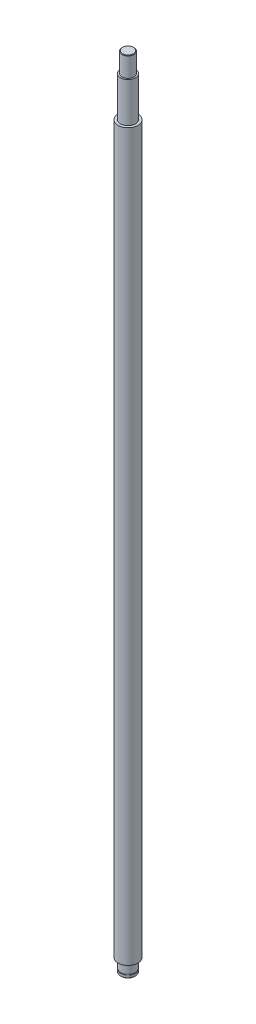
ISO-10303-21;
HEADER;
FILE_DESCRIPTION(('STEP AP214'),'2;1');
FILE_NAME('part.step','',(''),(''),'','','');
FILE_SCHEMA(('AUTOMOTIVE_DESIGN { 1 0 10303 214 1 1 1 1 }'));
ENDSEC;
DATA;
#1=APPLICATION_CONTEXT('core data for automotive mechanical design processes');
#2=APPLICATION_PROTOCOL_DEFINITION('international standard','automotive_design',2000,#1);
#3=PRODUCT_CONTEXT('',#1,'mechanical');
#4=PRODUCT('Part','Part','',(#3));
#5=PRODUCT_RELATED_PRODUCT_CATEGORY('part','',(#4));
#6=PRODUCT_DEFINITION_FORMATION('','',#4);
#7=PRODUCT_DEFINITION_CONTEXT('part definition',#1,'design');
#8=PRODUCT_DEFINITION('design','',#6,#7);
#9=PRODUCT_DEFINITION_SHAPE('','',#8);
#10=(LENGTH_UNIT() NAMED_UNIT(*) SI_UNIT(.MILLI.,.METRE.));
#11=(NAMED_UNIT(*) PLANE_ANGLE_UNIT() SI_UNIT($,.RADIAN.));
#12=(NAMED_UNIT(*) SI_UNIT($,.STERADIAN.) SOLID_ANGLE_UNIT());
#13=UNCERTAINTY_MEASURE_WITH_UNIT(LENGTH_MEASURE(1.E-05),#10,'distance_accuracy_value','');
#14=(GEOMETRIC_REPRESENTATION_CONTEXT(3) GLOBAL_UNCERTAINTY_ASSIGNED_CONTEXT((#13)) GLOBAL_UNIT_ASSIGNED_CONTEXT((#10,
#11,#12)) REPRESENTATION_CONTEXT('',''));
#15=CARTESIAN_POINT('',(0.,0.,0.));
#16=DIRECTION('',(0.,0.,1.));
#17=DIRECTION('',(1.,0.,0.));
#18=AXIS2_PLACEMENT_3D('',#15,#16,#17);
#19=CARTESIAN_POINT('',(0.,-800.,7.49999999999984));
#20=DIRECTION('',(0.,-1.,0.));
#21=DIRECTION('',(0.,0.,-1.));
#22=AXIS2_PLACEMENT_3D('',#19,#20,#21);
#23=PLANE('',#22);
#24=CARTESIAN_POINT('',(0.,-800.,-2.45029690981724E-13));
#25=DIRECTION('',(0.,1.,0.));
#26=DIRECTION('',(0.,0.,1.));
#27=AXIS2_PLACEMENT_3D('',#24,#25,#26);
#28=CIRCLE('',#27,7.0000000000001);
#29=CARTESIAN_POINT('',(0.,-800.,6.99999999999986));
#30=VERTEX_POINT('',#29);
#31=EDGE_CURVE('E16',#30,#30,#28,.T.);
#32=ORIENTED_EDGE('',*,*,#31,.F.);
#33=EDGE_LOOP('',(#32));
#34=FACE_BOUND('',#33,.T.);
#35=ADVANCED_FACE('F13',(#34),#23,.T.);
#36=CARTESIAN_POINT('',(0.,-799.5,-2.45029690981724E-13));
#37=DIRECTION('',(0.,1.,0.));
#38=DIRECTION('',(0.,0.,1.));
#39=AXIS2_PLACEMENT_3D('',#36,#37,#38);
#40=CONICAL_SURFACE('',#39,7.50000000000009,0.785398163397493);
#41=ORIENTED_EDGE('',*,*,#31,.T.);
#42=EDGE_LOOP('',(#41));
#43=FACE_BOUND('',#42,.T.);
#44=CARTESIAN_POINT('',(0.,-799.5,-2.45205938886883E-13));
#45=DIRECTION('',(0.,1.,0.));
#46=DIRECTION('',(0.,0.,1.));
#47=AXIS2_PLACEMENT_3D('',#44,#45,#46);
#48=CIRCLE('',#47,7.50000000000009);
#49=CARTESIAN_POINT('',(0.,-799.5,7.49999999999984));
#50=VERTEX_POINT('',#49);
#51=EDGE_CURVE('E56',#50,#50,#48,.T.);
#52=ORIENTED_EDGE('',*,*,#51,.F.);
#53=EDGE_LOOP('',(#52));
#54=FACE_BOUND('',#53,.T.);
#55=ADVANCED_FACE('F206',(#43,#54),#40,.T.);
#56=CARTESIAN_POINT('',(0.,0.,0.));
#57=DIRECTION('',(0.,1.,0.));
#58=DIRECTION('',(0.,0.,1.));
#59=AXIS2_PLACEMENT_3D('',#56,#57,#58);
#60=PLANE('',#59);
#61=CARTESIAN_POINT('',(0.,-1.705319913059E-10,0.));
#62=DIRECTION('',(0.,-1.,0.));
#63=DIRECTION('',(0.,0.,-1.));
#64=AXIS2_PLACEMENT_3D('',#61,#62,#63);
#65=CIRCLE('',#64,5.50000000009732);
#66=CARTESIAN_POINT('',(0.,-1.70530301757515E-10,-5.50000000009732));
#67=VERTEX_POINT('',#66);
#68=EDGE_CURVE('E54',#67,#67,#65,.T.);
#69=ORIENTED_EDGE('',*,*,#68,.F.);
#70=EDGE_LOOP('',(#69));
#71=FACE_BOUND('',#70,.T.);
#72=ADVANCED_FACE('F83',(#71),#60,.T.);
#73=CARTESIAN_POINT('',(0.,-798.575,-2.44922242209622E-13));
#74=DIRECTION('',(0.,1.,0.));
#75=DIRECTION('',(0.,0.,1.));
#76=AXIS2_PLACEMENT_3D('',#73,#74,#75);
#77=CYLINDRICAL_SURFACE('',#76,7.50000000000009);
#78=ORIENTED_EDGE('',*,*,#51,.T.);
#79=EDGE_LOOP('',(#78));
#80=FACE_BOUND('',#79,.T.);
#81=CARTESIAN_POINT('',(0.,-797.15,-2.44485195977084E-13));
#82=DIRECTION('',(0.,1.,0.));
#83=DIRECTION('',(0.,0.,1.));
#84=AXIS2_PLACEMENT_3D('',#81,#82,#83);
#85=CIRCLE('',#84,7.50000000000009);
#86=CARTESIAN_POINT('',(0.,-797.15,7.49999999999985));
#87=VERTEX_POINT('',#86);
#88=EDGE_CURVE('E52',#87,#87,#85,.T.);
#89=ORIENTED_EDGE('',*,*,#88,.F.);
#90=EDGE_LOOP('',(#89));
#91=FACE_BOUND('',#90,.T.);
#92=ADVANCED_FACE('F74',(#80,#91),#77,.T.);
#93=CARTESIAN_POINT('',(0.,-0.500000000045022,0.));
#94=DIRECTION('',(0.,-1.,0.));
#95=DIRECTION('',(0.,0.,-1.));
#96=AXIS2_PLACEMENT_3D('',#93,#94,#95);
#97=CONICAL_SURFACE('',#96,6.00000000002865,0.785398163454292);
#98=CARTESIAN_POINT('',(0.,-0.499999999999997,0.));
#99=DIRECTION('',(0.,1.,0.));
#100=DIRECTION('',(0.,0.,1.));
#101=AXIS2_PLACEMENT_3D('',#98,#99,#100);
#102=CIRCLE('',#101,6.);
#103=CARTESIAN_POINT('',(0.,-0.499999999999999,6.));
#104=VERTEX_POINT('',#103);
#105=EDGE_CURVE('E51',#104,#104,#102,.F.);
#106=ORIENTED_EDGE('',*,*,#105,.F.);
#107=EDGE_LOOP('',(#106));
#108=FACE_BOUND('',#107,.T.);
#109=ORIENTED_EDGE('',*,*,#68,.T.);
#110=EDGE_LOOP('',(#109));
#111=FACE_BOUND('',#110,.T.);
#112=ADVANCED_FACE('F71',(#108,#111),#97,.T.);
#113=CARTESIAN_POINT('',(0.,-797.15,7.14999999999967));
#114=DIRECTION('',(0.,1.,0.));
#115=DIRECTION('',(0.,0.,1.));
#116=AXIS2_PLACEMENT_3D('',#113,#114,#115);
#117=PLANE('',#116);
#118=CARTESIAN_POINT('',(0.,-797.15,-2.44485195977085E-13));
#119=DIRECTION('',(0.,1.,0.));
#120=DIRECTION('',(0.,0.,1.));
#121=AXIS2_PLACEMENT_3D('',#118,#119,#120);
#122=CIRCLE('',#121,7.14999999999992);
#123=CARTESIAN_POINT('',(0.,-797.15,7.14999999999968));
#124=VERTEX_POINT('',#123);
#125=EDGE_CURVE('E48',#124,#124,#122,.T.);
#126=ORIENTED_EDGE('',*,*,#125,.F.);
#127=EDGE_LOOP('',(#126));
#128=FACE_BOUND('',#127,.T.);
#129=ORIENTED_EDGE('',*,*,#88,.T.);
#130=EDGE_LOOP('',(#129));
#131=FACE_BOUND('',#130,.T.);
#132=ADVANCED_FACE('F73',(#128,#131),#117,.T.);
#133=CARTESIAN_POINT('',(0.,-10.,0.));
#134=DIRECTION('',(0.,1.,0.));
#135=DIRECTION('',(0.,0.,1.));
#136=AXIS2_PLACEMENT_3D('',#133,#134,#135);
#137=CYLINDRICAL_SURFACE('',#136,6.);
#138=CARTESIAN_POINT('',(0.,-20.,0.));
#139=DIRECTION('',(0.,1.,0.));
#140=DIRECTION('',(0.,0.,1.));
#141=AXIS2_PLACEMENT_3D('',#138,#139,#140);
#142=CIRCLE('',#141,6.);
#143=CARTESIAN_POINT('',(0.,-20.,5.99999999999999));
#144=VERTEX_POINT('',#143);
#145=EDGE_CURVE('E45',#144,#144,#142,.F.);
#146=ORIENTED_EDGE('',*,*,#145,.F.);
#147=EDGE_LOOP('',(#146));
#148=FACE_BOUND('',#147,.T.);
#149=ORIENTED_EDGE('',*,*,#105,.T.);
#150=EDGE_LOOP('',(#149));
#151=FACE_BOUND('',#150,.T.);
#152=ADVANCED_FACE('F69',(#148,#151),#137,.T.);
#153=CARTESIAN_POINT('',(0.,-796.575,-2.44308843988517E-13));
#154=DIRECTION('',(0.,1.,0.));
#155=DIRECTION('',(0.,0.,1.));
#156=AXIS2_PLACEMENT_3D('',#153,#154,#155);
#157=CYLINDRICAL_SURFACE('',#156,7.14999999999992);
#158=ORIENTED_EDGE('',*,*,#125,.T.);
#159=EDGE_LOOP('',(#158));
#160=FACE_BOUND('',#159,.T.);
#161=CARTESIAN_POINT('',(0.,-796.,-2.44132491999949E-13));
#162=DIRECTION('',(0.,1.,0.));
#163=DIRECTION('',(0.,0.,1.));
#164=AXIS2_PLACEMENT_3D('',#161,#162,#163);
#165=CIRCLE('',#164,7.14999999999992);
#166=CARTESIAN_POINT('',(0.,-796.,7.14999999999968));
#167=VERTEX_POINT('',#166);
#168=EDGE_CURVE('E42',#167,#167,#165,.T.);
#169=ORIENTED_EDGE('',*,*,#168,.F.);
#170=EDGE_LOOP('',(#169));
#171=FACE_BOUND('',#170,.T.);
#172=ADVANCED_FACE('F115',(#160,#171),#157,.T.);
#173=CARTESIAN_POINT('',(0.,-20.,6.));
#174=DIRECTION('',(0.,1.,0.));
#175=DIRECTION('',(0.,0.,1.));
#176=AXIS2_PLACEMENT_3D('',#173,#174,#175);
#177=PLANE('',#176);
#178=ORIENTED_EDGE('',*,*,#145,.T.);
#179=EDGE_LOOP('',(#178));
#180=FACE_BOUND('',#179,.T.);
#181=CARTESIAN_POINT('',(0.,-20.,0.));
#182=DIRECTION('',(0.,1.,0.));
#183=DIRECTION('',(0.,0.,1.));
#184=AXIS2_PLACEMENT_3D('',#181,#182,#183);
#185=CIRCLE('',#184,7.5);
#186=CARTESIAN_POINT('',(0.,-20.,7.49999999999999));
#187=VERTEX_POINT('',#186);
#188=EDGE_CURVE('E39',#187,#187,#185,.F.);
#189=ORIENTED_EDGE('',*,*,#188,.F.);
#190=EDGE_LOOP('',(#189));
#191=FACE_BOUND('',#190,.T.);
#192=ADVANCED_FACE('F111',(#180,#191),#177,.T.);
#193=CARTESIAN_POINT('',(0.,-796.,7.49999999999967));
#194=DIRECTION('',(0.,-1.,0.));
#195=DIRECTION('',(0.,0.,-1.));
#196=AXIS2_PLACEMENT_3D('',#193,#194,#195);
#197=PLANE('',#196);
#198=ORIENTED_EDGE('',*,*,#168,.T.);
#199=EDGE_LOOP('',(#198));
#200=FACE_BOUND('',#199,.T.);
#201=CARTESIAN_POINT('',(0.,-796.,-2.44132491999949E-13));
#202=DIRECTION('',(0.,1.,0.));
#203=DIRECTION('',(0.,0.,1.));
#204=AXIS2_PLACEMENT_3D('',#201,#202,#203);
#205=CIRCLE('',#204,7.49999999999992);
#206=CARTESIAN_POINT('',(0.,-796.,7.49999999999968));
#207=VERTEX_POINT('',#206);
#208=EDGE_CURVE('E36',#207,#207,#205,.T.);
#209=ORIENTED_EDGE('',*,*,#208,.F.);
#210=EDGE_LOOP('',(#209));
#211=FACE_BOUND('',#210,.T.);
#212=ADVANCED_FACE('F107',(#200,#211),#197,.T.);
#213=CARTESIAN_POINT('',(0.,-40.,0.));
#214=DIRECTION('',(0.,1.,0.));
#215=DIRECTION('',(0.,0.,1.));
#216=AXIS2_PLACEMENT_3D('',#213,#214,#215);
#217=CYLINDRICAL_SURFACE('',#216,7.5);
#218=CARTESIAN_POINT('',(0.,-60.,0.));
#219=DIRECTION('',(0.,1.,0.));
#220=DIRECTION('',(0.,0.,1.));
#221=AXIS2_PLACEMENT_3D('',#218,#219,#220);
#222=CIRCLE('',#221,7.5);
#223=CARTESIAN_POINT('',(0.,-60.,7.49999999999998));
#224=VERTEX_POINT('',#223);
#225=EDGE_CURVE('E33',#224,#224,#222,.F.);
#226=ORIENTED_EDGE('',*,*,#225,.F.);
#227=EDGE_LOOP('',(#226));
#228=FACE_BOUND('',#227,.T.);
#229=ORIENTED_EDGE('',*,*,#188,.T.);
#230=EDGE_LOOP('',(#229));
#231=FACE_BOUND('',#230,.T.);
#232=ADVANCED_FACE('F103',(#228,#231),#217,.T.);
#233=CARTESIAN_POINT('',(0.,-791.5,-2.42752346002462E-13));
#234=DIRECTION('',(0.,1.,0.));
#235=DIRECTION('',(0.,0.,1.));
#236=AXIS2_PLACEMENT_3D('',#233,#234,#235);
#237=CYLINDRICAL_SURFACE('',#236,7.49999999999992);
#238=ORIENTED_EDGE('',*,*,#208,.T.);
#239=EDGE_LOOP('',(#238));
#240=FACE_BOUND('',#239,.T.);
#241=CARTESIAN_POINT('',(0.,-787.,-2.41372200004975E-13));
#242=DIRECTION('',(0.,1.,0.));
#243=DIRECTION('',(0.,0.,1.));
#244=AXIS2_PLACEMENT_3D('',#241,#242,#243);
#245=CIRCLE('',#244,7.49999999999992);
#246=CARTESIAN_POINT('',(0.,-787.,7.49999999999968));
#247=VERTEX_POINT('',#246);
#248=EDGE_CURVE('E25',#247,#247,#245,.T.);
#249=ORIENTED_EDGE('',*,*,#248,.F.);
#250=EDGE_LOOP('',(#249));
#251=FACE_BOUND('',#250,.T.);
#252=ADVANCED_FACE('F99',(#240,#251),#237,.T.);
#253=CARTESIAN_POINT('',(0.,-60.,7.49999999999999));
#254=DIRECTION('',(0.,1.,0.));
#255=DIRECTION('',(0.,0.,1.));
#256=AXIS2_PLACEMENT_3D('',#253,#254,#255);
#257=PLANE('',#256);
#258=ORIENTED_EDGE('',*,*,#225,.T.);
#259=EDGE_LOOP('',(#258));
#260=FACE_BOUND('',#259,.T.);
#261=CARTESIAN_POINT('',(0.,-60.,0.));
#262=DIRECTION('',(0.,1.,0.));
#263=DIRECTION('',(0.,0.,1.));
#264=AXIS2_PLACEMENT_3D('',#261,#262,#263);
#265=CIRCLE('',#264,10.);
#266=CARTESIAN_POINT('',(0.,-60.,9.99999999999998));
#267=VERTEX_POINT('',#266);
#268=EDGE_CURVE('E20',#267,#267,#265,.F.);
#269=ORIENTED_EDGE('',*,*,#268,.F.);
#270=EDGE_LOOP('',(#269));
#271=FACE_BOUND('',#270,.T.);
#272=ADVANCED_FACE('F92',(#260,#271),#257,.T.);
#273=CARTESIAN_POINT('',(0.,-787.,9.99999999999985));
#274=DIRECTION('',(0.,-1.,0.));
#275=DIRECTION('',(0.,0.,-1.));
#276=AXIS2_PLACEMENT_3D('',#273,#274,#275);
#277=PLANE('',#276);
#278=ORIENTED_EDGE('',*,*,#248,.T.);
#279=EDGE_LOOP('',(#278));
#280=FACE_BOUND('',#279,.T.);
#281=CARTESIAN_POINT('',(0.,-787.,-2.41372200004974E-13));
#282=DIRECTION('',(0.,1.,0.));
#283=DIRECTION('',(0.,0.,1.));
#284=AXIS2_PLACEMENT_3D('',#281,#282,#283);
#285=CIRCLE('',#284,10.);
#286=CARTESIAN_POINT('',(0.,-787.,9.99999999999976));
#287=VERTEX_POINT('',#286);
#288=EDGE_CURVE('E9',#287,#287,#285,.T.);
#289=ORIENTED_EDGE('',*,*,#288,.F.);
#290=EDGE_LOOP('',(#289));
#291=FACE_BOUND('',#290,.T.);
#292=ADVANCED_FACE('F87',(#280,#291),#277,.T.);
#293=CARTESIAN_POINT('',(0.,-423.5,-1.29887073319068E-13));
#294=DIRECTION('',(0.,1.,0.));
#295=DIRECTION('',(0.,0.,1.));
#296=AXIS2_PLACEMENT_3D('',#293,#294,#295);
#297=CYLINDRICAL_SURFACE('',#296,10.);
#298=ORIENTED_EDGE('',*,*,#288,.T.);
#299=EDGE_LOOP('',(#298));
#300=FACE_BOUND('',#299,.T.);
#301=ORIENTED_EDGE('',*,*,#268,.T.);
#302=EDGE_LOOP('',(#301));
#303=FACE_BOUND('',#302,.T.);
#304=ADVANCED_FACE('F85',(#300,#303),#297,.T.);
#305=CLOSED_SHELL('',(#35,#55,#72,#92,#112,#132,#152,#172,#192,#212,#232,#252,#272,#292,#304));
#306=MANIFOLD_SOLID_BREP('B1',#305);
#307=ADVANCED_BREP_SHAPE_REPRESENTATION('',(#18,#306),#14);
#308=SHAPE_DEFINITION_REPRESENTATION(#9,#307);
ENDSEC;
END-ISO-10303-21;
